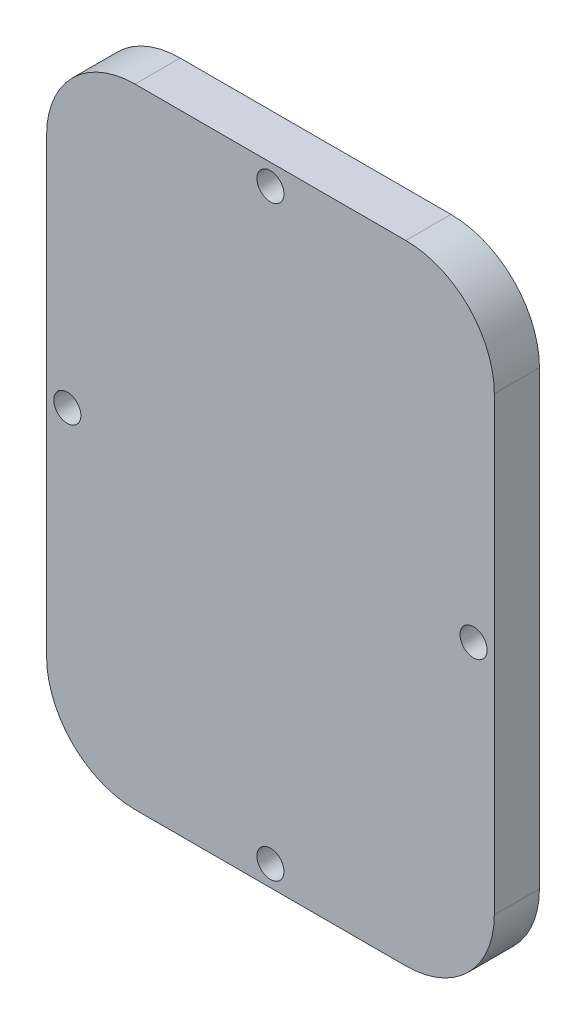
ISO-10303-21;
HEADER;
FILE_DESCRIPTION(('STEP AP214'),'2;1');
FILE_NAME('part.step','',(''),(''),'','','');
FILE_SCHEMA(('AUTOMOTIVE_DESIGN { 1 0 10303 214 1 1 1 1 }'));
ENDSEC;
DATA;
#1=APPLICATION_CONTEXT('core data for automotive mechanical design processes');
#2=APPLICATION_PROTOCOL_DEFINITION('international standard','automotive_design',2000,#1);
#3=PRODUCT_CONTEXT('',#1,'mechanical');
#4=PRODUCT('Part','Part','',(#3));
#5=PRODUCT_RELATED_PRODUCT_CATEGORY('part','',(#4));
#6=PRODUCT_DEFINITION_FORMATION('','',#4);
#7=PRODUCT_DEFINITION_CONTEXT('part definition',#1,'design');
#8=PRODUCT_DEFINITION('design','',#6,#7);
#9=PRODUCT_DEFINITION_SHAPE('','',#8);
#10=(LENGTH_UNIT() NAMED_UNIT(*) SI_UNIT(.MILLI.,.METRE.));
#11=(NAMED_UNIT(*) PLANE_ANGLE_UNIT() SI_UNIT($,.RADIAN.));
#12=(NAMED_UNIT(*) SI_UNIT($,.STERADIAN.) SOLID_ANGLE_UNIT());
#13=UNCERTAINTY_MEASURE_WITH_UNIT(LENGTH_MEASURE(1.E-05),#10,'distance_accuracy_value','');
#14=(GEOMETRIC_REPRESENTATION_CONTEXT(3) GLOBAL_UNCERTAINTY_ASSIGNED_CONTEXT((#13)) GLOBAL_UNIT_ASSIGNED_CONTEXT((#10,
#11,#12)) REPRESENTATION_CONTEXT('',''));
#15=CARTESIAN_POINT('',(0.,0.,0.));
#16=DIRECTION('',(0.,0.,1.));
#17=DIRECTION('',(1.,0.,0.));
#18=AXIS2_PLACEMENT_3D('',#15,#16,#17);
#19=CARTESIAN_POINT('',(24.8,0.,5.));
#20=DIRECTION('',(-1.,0.,0.));
#21=DIRECTION('',(0.,0.,1.));
#22=AXIS2_PLACEMENT_3D('',#19,#20,#21);
#23=PLANE('',#22);
#24=DIRECTION('',(0.,1.,0.));
#25=VECTOR('',#24,1.);
#26=CARTESIAN_POINT('',(24.8,0.,0.));
#27=LINE('',#26,#25);
#28=CARTESIAN_POINT('',(24.8,-24.9999999999999,0.));
#29=VERTEX_POINT('',#28);
#30=CARTESIAN_POINT('',(24.8,24.9999999999999,0.));
#31=VERTEX_POINT('',#30);
#32=EDGE_CURVE('E162',#29,#31,#27,.T.);
#33=ORIENTED_EDGE('',*,*,#32,.T.);
#34=DIRECTION('',(0.,0.,-1.));
#35=VECTOR('',#34,1.);
#36=CARTESIAN_POINT('',(24.8,24.9999999999999,5.));
#37=LINE('',#36,#35);
#38=CARTESIAN_POINT('',(24.8,24.9999999999999,5.));
#39=VERTEX_POINT('',#38);
#40=EDGE_CURVE('E11',#39,#31,#37,.T.);
#41=ORIENTED_EDGE('',*,*,#40,.F.);
#42=DIRECTION('',(0.,1.,0.));
#43=VECTOR('',#42,1.);
#44=CARTESIAN_POINT('',(24.8,0.,5.));
#45=LINE('',#44,#43);
#46=CARTESIAN_POINT('',(24.8,-24.9999999999999,5.));
#47=VERTEX_POINT('',#46);
#48=EDGE_CURVE('E231',#47,#39,#45,.T.);
#49=ORIENTED_EDGE('',*,*,#48,.F.);
#50=DIRECTION('',(0.,0.,-1.));
#51=VECTOR('',#50,1.);
#52=CARTESIAN_POINT('',(24.8,-24.9999999999999,5.));
#53=LINE('',#52,#51);
#54=EDGE_CURVE('E149',#47,#29,#53,.T.);
#55=ORIENTED_EDGE('',*,*,#54,.T.);
#56=EDGE_LOOP('',(#33,#41,#49,#55));
#57=FACE_BOUND('',#56,.T.);
#58=ADVANCED_FACE('F45',(#57),#23,.F.);
#59=CARTESIAN_POINT('',(15.,25.,5.));
#60=DIRECTION('',(0.,0.,-1.));
#61=DIRECTION('',(-1.,0.,0.));
#62=AXIS2_PLACEMENT_3D('',#59,#60,#61);
#63=CYLINDRICAL_SURFACE('',#62,9.8);
#64=CARTESIAN_POINT('',(15.,25.,0.));
#65=DIRECTION('',(0.,0.,1.));
#66=DIRECTION('',(1.,0.,0.));
#67=AXIS2_PLACEMENT_3D('',#64,#65,#66);
#68=CIRCLE('',#67,9.8);
#69=CARTESIAN_POINT('',(14.9999999999999,34.8,0.));
#70=VERTEX_POINT('',#69);
#71=EDGE_CURVE('E166',#31,#70,#68,.T.);
#72=ORIENTED_EDGE('',*,*,#71,.T.);
#73=DIRECTION('',(0.,0.,-1.));
#74=VECTOR('',#73,1.);
#75=CARTESIAN_POINT('',(14.9999999999999,34.8,5.));
#76=LINE('',#75,#74);
#77=CARTESIAN_POINT('',(14.9999999999999,34.8,5.));
#78=VERTEX_POINT('',#77);
#79=EDGE_CURVE('E55',#78,#70,#76,.T.);
#80=ORIENTED_EDGE('',*,*,#79,.F.);
#81=CARTESIAN_POINT('',(15.,25.,5.));
#82=DIRECTION('',(0.,0.,1.));
#83=DIRECTION('',(1.,0.,0.));
#84=AXIS2_PLACEMENT_3D('',#81,#82,#83);
#85=CIRCLE('',#84,9.8);
#86=EDGE_CURVE('E102',#39,#78,#85,.T.);
#87=ORIENTED_EDGE('',*,*,#86,.F.);
#88=ORIENTED_EDGE('',*,*,#40,.T.);
#89=EDGE_LOOP('',(#72,#80,#87,#88));
#90=FACE_BOUND('',#89,.T.);
#91=ADVANCED_FACE('F274',(#90),#63,.T.);
#92=CARTESIAN_POINT('',(0.,34.8,5.));
#93=DIRECTION('',(0.,-1.,0.));
#94=DIRECTION('',(0.,0.,-1.));
#95=AXIS2_PLACEMENT_3D('',#92,#93,#94);
#96=PLANE('',#95);
#97=DIRECTION('',(-1.,0.,0.));
#98=VECTOR('',#97,1.);
#99=CARTESIAN_POINT('',(0.,34.8,0.));
#100=LINE('',#99,#98);
#101=CARTESIAN_POINT('',(-14.9999999999999,34.8,0.));
#102=VERTEX_POINT('',#101);
#103=EDGE_CURVE('E169',#70,#102,#100,.T.);
#104=ORIENTED_EDGE('',*,*,#103,.T.);
#105=DIRECTION('',(0.,0.,-1.));
#106=VECTOR('',#105,1.);
#107=CARTESIAN_POINT('',(-14.9999999999999,34.8,5.));
#108=LINE('',#107,#106);
#109=CARTESIAN_POINT('',(-14.9999999999999,34.8,5.));
#110=VERTEX_POINT('',#109);
#111=EDGE_CURVE('E201',#110,#102,#108,.T.);
#112=ORIENTED_EDGE('',*,*,#111,.F.);
#113=DIRECTION('',(-1.,0.,0.));
#114=VECTOR('',#113,1.);
#115=CARTESIAN_POINT('',(0.,34.8,5.));
#116=LINE('',#115,#114);
#117=EDGE_CURVE('E211',#78,#110,#116,.T.);
#118=ORIENTED_EDGE('',*,*,#117,.F.);
#119=ORIENTED_EDGE('',*,*,#79,.T.);
#120=EDGE_LOOP('',(#104,#112,#118,#119));
#121=FACE_BOUND('',#120,.T.);
#122=ADVANCED_FACE('F209',(#121),#96,.F.);
#123=CARTESIAN_POINT('',(-15.,25.,5.));
#124=DIRECTION('',(0.,0.,-1.));
#125=DIRECTION('',(-1.,0.,0.));
#126=AXIS2_PLACEMENT_3D('',#123,#124,#125);
#127=CYLINDRICAL_SURFACE('',#126,9.80000000000001);
#128=CARTESIAN_POINT('',(-15.,25.,0.));
#129=DIRECTION('',(0.,0.,1.));
#130=DIRECTION('',(1.,0.,0.));
#131=AXIS2_PLACEMENT_3D('',#128,#129,#130);
#132=CIRCLE('',#131,9.80000000000001);
#133=CARTESIAN_POINT('',(-24.8,24.9999999999999,0.));
#134=VERTEX_POINT('',#133);
#135=EDGE_CURVE('E172',#102,#134,#132,.T.);
#136=ORIENTED_EDGE('',*,*,#135,.T.);
#137=DIRECTION('',(0.,0.,-1.));
#138=VECTOR('',#137,1.);
#139=CARTESIAN_POINT('',(-24.8,24.9999999999999,5.));
#140=LINE('',#139,#138);
#141=CARTESIAN_POINT('',(-24.8,24.9999999999999,5.));
#142=VERTEX_POINT('',#141);
#143=EDGE_CURVE('E198',#142,#134,#140,.T.);
#144=ORIENTED_EDGE('',*,*,#143,.F.);
#145=CARTESIAN_POINT('',(-15.,25.,5.));
#146=DIRECTION('',(0.,0.,1.));
#147=DIRECTION('',(1.,0.,0.));
#148=AXIS2_PLACEMENT_3D('',#145,#146,#147);
#149=CIRCLE('',#148,9.80000000000001);
#150=EDGE_CURVE('E222',#110,#142,#149,.T.);
#151=ORIENTED_EDGE('',*,*,#150,.F.);
#152=ORIENTED_EDGE('',*,*,#111,.T.);
#153=EDGE_LOOP('',(#136,#144,#151,#152));
#154=FACE_BOUND('',#153,.T.);
#155=ADVANCED_FACE('F220',(#154),#127,.T.);
#156=CARTESIAN_POINT('',(-24.8,0.,5.));
#157=DIRECTION('',(-1.,0.,0.));
#158=DIRECTION('',(0.,0.,1.));
#159=AXIS2_PLACEMENT_3D('',#156,#157,#158);
#160=PLANE('',#159);
#161=DIRECTION('',(0.,1.,0.));
#162=VECTOR('',#161,1.);
#163=CARTESIAN_POINT('',(-24.8,0.,0.));
#164=LINE('',#163,#162);
#165=CARTESIAN_POINT('',(-24.8,-24.9999999999999,0.));
#166=VERTEX_POINT('',#165);
#167=EDGE_CURVE('E176',#166,#134,#164,.T.);
#168=ORIENTED_EDGE('',*,*,#167,.F.);
#169=DIRECTION('',(0.,0.,-1.));
#170=VECTOR('',#169,1.);
#171=CARTESIAN_POINT('',(-24.8,-24.9999999999999,5.));
#172=LINE('',#171,#170);
#173=CARTESIAN_POINT('',(-24.8,-24.9999999999999,5.));
#174=VERTEX_POINT('',#173);
#175=EDGE_CURVE('E128',#174,#166,#172,.T.);
#176=ORIENTED_EDGE('',*,*,#175,.F.);
#177=DIRECTION('',(0.,1.,0.));
#178=VECTOR('',#177,1.);
#179=CARTESIAN_POINT('',(-24.8,0.,5.));
#180=LINE('',#179,#178);
#181=EDGE_CURVE('E135',#174,#142,#180,.T.);
#182=ORIENTED_EDGE('',*,*,#181,.T.);
#183=ORIENTED_EDGE('',*,*,#143,.T.);
#184=EDGE_LOOP('',(#168,#176,#182,#183));
#185=FACE_BOUND('',#184,.T.);
#186=ADVANCED_FACE('F285',(#185),#160,.T.);
#187=CARTESIAN_POINT('',(-15.,-25.,5.));
#188=DIRECTION('',(0.,0.,-1.));
#189=DIRECTION('',(-1.,0.,0.));
#190=AXIS2_PLACEMENT_3D('',#187,#188,#189);
#191=CYLINDRICAL_SURFACE('',#190,9.8);
#192=CARTESIAN_POINT('',(-15.,-25.,0.));
#193=DIRECTION('',(0.,0.,1.));
#194=DIRECTION('',(1.,0.,0.));
#195=AXIS2_PLACEMENT_3D('',#192,#193,#194);
#196=CIRCLE('',#195,9.8);
#197=CARTESIAN_POINT('',(-14.9999999999999,-34.8,0.));
#198=VERTEX_POINT('',#197);
#199=EDGE_CURVE('E122',#198,#166,#196,.F.);
#200=ORIENTED_EDGE('',*,*,#199,.F.);
#201=DIRECTION('',(0.,0.,-1.));
#202=VECTOR('',#201,1.);
#203=CARTESIAN_POINT('',(-14.9999999999999,-34.8,5.));
#204=LINE('',#203,#202);
#205=CARTESIAN_POINT('',(-14.9999999999999,-34.8,5.));
#206=VERTEX_POINT('',#205);
#207=EDGE_CURVE('E117',#206,#198,#204,.T.);
#208=ORIENTED_EDGE('',*,*,#207,.F.);
#209=CARTESIAN_POINT('',(-15.,-25.,5.));
#210=DIRECTION('',(0.,0.,1.));
#211=DIRECTION('',(1.,0.,0.));
#212=AXIS2_PLACEMENT_3D('',#209,#210,#211);
#213=CIRCLE('',#212,9.8);
#214=EDGE_CURVE('E120',#206,#174,#213,.F.);
#215=ORIENTED_EDGE('',*,*,#214,.T.);
#216=ORIENTED_EDGE('',*,*,#175,.T.);
#217=EDGE_LOOP('',(#200,#208,#215,#216));
#218=FACE_BOUND('',#217,.T.);
#219=ADVANCED_FACE('F119',(#218),#191,.T.);
#220=CARTESIAN_POINT('',(0.,-34.8,5.));
#221=DIRECTION('',(0.,-1.,0.));
#222=DIRECTION('',(1.,0.,0.));
#223=AXIS2_PLACEMENT_3D('',#220,#221,#222);
#224=PLANE('',#223);
#225=DIRECTION('',(-1.,0.,0.));
#226=VECTOR('',#225,1.);
#227=CARTESIAN_POINT('',(0.,-34.8,0.));
#228=LINE('',#227,#226);
#229=CARTESIAN_POINT('',(14.9999999999999,-34.8,0.));
#230=VERTEX_POINT('',#229);
#231=EDGE_CURVE('E182',#230,#198,#228,.T.);
#232=ORIENTED_EDGE('',*,*,#231,.F.);
#233=DIRECTION('',(0.,0.,-1.));
#234=VECTOR('',#233,1.);
#235=CARTESIAN_POINT('',(14.9999999999999,-34.8,5.));
#236=LINE('',#235,#234);
#237=CARTESIAN_POINT('',(14.9999999999999,-34.8,5.));
#238=VERTEX_POINT('',#237);
#239=EDGE_CURVE('E91',#238,#230,#236,.T.);
#240=ORIENTED_EDGE('',*,*,#239,.F.);
#241=DIRECTION('',(-1.,0.,0.));
#242=VECTOR('',#241,1.);
#243=CARTESIAN_POINT('',(0.,-34.8,5.));
#244=LINE('',#243,#242);
#245=EDGE_CURVE('E133',#238,#206,#244,.T.);
#246=ORIENTED_EDGE('',*,*,#245,.T.);
#247=ORIENTED_EDGE('',*,*,#207,.T.);
#248=EDGE_LOOP('',(#232,#240,#246,#247));
#249=FACE_BOUND('',#248,.T.);
#250=ADVANCED_FACE('F138',(#249),#224,.T.);
#251=CARTESIAN_POINT('',(15.,-25.,5.));
#252=DIRECTION('',(0.,0.,-1.));
#253=DIRECTION('',(-1.,0.,0.));
#254=AXIS2_PLACEMENT_3D('',#251,#252,#253);
#255=CYLINDRICAL_SURFACE('',#254,9.8);
#256=CARTESIAN_POINT('',(15.,-25.,0.));
#257=DIRECTION('',(0.,0.,1.));
#258=DIRECTION('',(1.,0.,0.));
#259=AXIS2_PLACEMENT_3D('',#256,#257,#258);
#260=CIRCLE('',#259,9.8);
#261=EDGE_CURVE('E94',#230,#29,#260,.T.);
#262=ORIENTED_EDGE('',*,*,#261,.T.);
#263=ORIENTED_EDGE('',*,*,#54,.F.);
#264=CARTESIAN_POINT('',(15.,-25.,5.));
#265=DIRECTION('',(0.,0.,1.));
#266=DIRECTION('',(1.,0.,0.));
#267=AXIS2_PLACEMENT_3D('',#264,#265,#266);
#268=CIRCLE('',#267,9.8);
#269=EDGE_CURVE('E63',#238,#47,#268,.T.);
#270=ORIENTED_EDGE('',*,*,#269,.F.);
#271=ORIENTED_EDGE('',*,*,#239,.T.);
#272=EDGE_LOOP('',(#262,#263,#270,#271));
#273=FACE_BOUND('',#272,.T.);
#274=ADVANCED_FACE('F263',(#273),#255,.T.);
#275=CARTESIAN_POINT('',(0.,32.5,5.));
#276=DIRECTION('',(0.,0.,-1.));
#277=DIRECTION('',(-1.,0.,0.));
#278=AXIS2_PLACEMENT_3D('',#275,#276,#277);
#279=CYLINDRICAL_SURFACE('',#278,1.5);
#280=CARTESIAN_POINT('',(0.,32.5,5.));
#281=DIRECTION('',(0.,0.,1.));
#282=DIRECTION('',(1.,0.,0.));
#283=AXIS2_PLACEMENT_3D('',#280,#281,#282);
#284=CIRCLE('',#283,1.5);
#285=CARTESIAN_POINT('',(1.5,32.5,5.));
#286=VERTEX_POINT('',#285);
#287=EDGE_CURVE('E234',#286,#286,#284,.T.);
#288=ORIENTED_EDGE('',*,*,#287,.T.);
#289=EDGE_LOOP('',(#288));
#290=FACE_BOUND('',#289,.T.);
#291=CARTESIAN_POINT('',(0.,32.5,0.));
#292=DIRECTION('',(0.,0.,1.));
#293=DIRECTION('',(1.,0.,0.));
#294=AXIS2_PLACEMENT_3D('',#291,#292,#293);
#295=CIRCLE('',#294,1.5);
#296=CARTESIAN_POINT('',(1.5,32.5,0.));
#297=VERTEX_POINT('',#296);
#298=EDGE_CURVE('E158',#297,#297,#295,.T.);
#299=ORIENTED_EDGE('',*,*,#298,.F.);
#300=EDGE_LOOP('',(#299));
#301=FACE_BOUND('',#300,.T.);
#302=ADVANCED_FACE('F261',(#290,#301),#279,.F.);
#303=CARTESIAN_POINT('',(22.5,0.,5.));
#304=DIRECTION('',(0.,0.,-1.));
#305=DIRECTION('',(-1.,0.,0.));
#306=AXIS2_PLACEMENT_3D('',#303,#304,#305);
#307=CYLINDRICAL_SURFACE('',#306,1.5);
#308=CARTESIAN_POINT('',(22.5,0.,5.));
#309=DIRECTION('',(0.,0.,1.));
#310=DIRECTION('',(1.,0.,0.));
#311=AXIS2_PLACEMENT_3D('',#308,#309,#310);
#312=CIRCLE('',#311,1.5);
#313=CARTESIAN_POINT('',(24.,0.,5.));
#314=VERTEX_POINT('',#313);
#315=EDGE_CURVE('E238',#314,#314,#312,.T.);
#316=ORIENTED_EDGE('',*,*,#315,.T.);
#317=EDGE_LOOP('',(#316));
#318=FACE_BOUND('',#317,.T.);
#319=CARTESIAN_POINT('',(22.5,0.,0.));
#320=DIRECTION('',(0.,0.,1.));
#321=DIRECTION('',(1.,0.,0.));
#322=AXIS2_PLACEMENT_3D('',#319,#320,#321);
#323=CIRCLE('',#322,1.5);
#324=CARTESIAN_POINT('',(24.,0.,0.));
#325=VERTEX_POINT('',#324);
#326=EDGE_CURVE('E154',#325,#325,#323,.T.);
#327=ORIENTED_EDGE('',*,*,#326,.F.);
#328=EDGE_LOOP('',(#327));
#329=FACE_BOUND('',#328,.T.);
#330=ADVANCED_FACE('F251',(#318,#329),#307,.F.);
#331=CARTESIAN_POINT('',(0.,-32.5,5.));
#332=DIRECTION('',(0.,0.,-1.));
#333=DIRECTION('',(-1.,0.,0.));
#334=AXIS2_PLACEMENT_3D('',#331,#332,#333);
#335=CYLINDRICAL_SURFACE('',#334,1.5);
#336=CARTESIAN_POINT('',(0.,-32.5,5.));
#337=DIRECTION('',(0.,0.,1.));
#338=DIRECTION('',(1.,0.,0.));
#339=AXIS2_PLACEMENT_3D('',#336,#337,#338);
#340=CIRCLE('',#339,1.5);
#341=CARTESIAN_POINT('',(1.50000000000002,-32.5,5.));
#342=VERTEX_POINT('',#341);
#343=EDGE_CURVE('E191',#342,#342,#340,.F.);
#344=ORIENTED_EDGE('',*,*,#343,.F.);
#345=EDGE_LOOP('',(#344));
#346=FACE_BOUND('',#345,.T.);
#347=CARTESIAN_POINT('',(0.,-32.5,0.));
#348=DIRECTION('',(0.,0.,1.));
#349=DIRECTION('',(1.,0.,0.));
#350=AXIS2_PLACEMENT_3D('',#347,#348,#349);
#351=CIRCLE('',#350,1.5);
#352=CARTESIAN_POINT('',(1.50000000000002,-32.5,0.));
#353=VERTEX_POINT('',#352);
#354=EDGE_CURVE('E150',#353,#353,#351,.F.);
#355=ORIENTED_EDGE('',*,*,#354,.T.);
#356=EDGE_LOOP('',(#355));
#357=FACE_BOUND('',#356,.T.);
#358=ADVANCED_FACE('F47',(#346,#357),#335,.F.);
#359=CARTESIAN_POINT('',(-22.5,0.,5.));
#360=DIRECTION('',(0.,0.,-1.));
#361=DIRECTION('',(-1.,0.,0.));
#362=AXIS2_PLACEMENT_3D('',#359,#360,#361);
#363=CYLINDRICAL_SURFACE('',#362,1.5);
#364=CARTESIAN_POINT('',(-22.5,0.,5.));
#365=DIRECTION('',(0.,0.,1.));
#366=DIRECTION('',(1.,0.,0.));
#367=AXIS2_PLACEMENT_3D('',#364,#365,#366);
#368=CIRCLE('',#367,1.5);
#369=CARTESIAN_POINT('',(-21.,0.,5.));
#370=VERTEX_POINT('',#369);
#371=EDGE_CURVE('E142',#370,#370,#368,.F.);
#372=ORIENTED_EDGE('',*,*,#371,.F.);
#373=EDGE_LOOP('',(#372));
#374=FACE_BOUND('',#373,.T.);
#375=CARTESIAN_POINT('',(-22.5,0.,0.));
#376=DIRECTION('',(0.,0.,1.));
#377=DIRECTION('',(1.,0.,0.));
#378=AXIS2_PLACEMENT_3D('',#375,#376,#377);
#379=CIRCLE('',#378,1.5);
#380=CARTESIAN_POINT('',(-21.,0.,0.));
#381=VERTEX_POINT('',#380);
#382=EDGE_CURVE('E187',#381,#381,#379,.F.);
#383=ORIENTED_EDGE('',*,*,#382,.T.);
#384=EDGE_LOOP('',(#383));
#385=FACE_BOUND('',#384,.T.);
#386=ADVANCED_FACE('F250',(#374,#385),#363,.F.);
#387=CARTESIAN_POINT('',(0.,0.,5.));
#388=DIRECTION('',(0.,0.,1.));
#389=DIRECTION('',(1.,0.,0.));
#390=AXIS2_PLACEMENT_3D('',#387,#388,#389);
#391=PLANE('',#390);
#392=ORIENTED_EDGE('',*,*,#343,.T.);
#393=EDGE_LOOP('',(#392));
#394=FACE_BOUND('',#393,.T.);
#395=ORIENTED_EDGE('',*,*,#315,.F.);
#396=EDGE_LOOP('',(#395));
#397=FACE_BOUND('',#396,.T.);
#398=ORIENTED_EDGE('',*,*,#287,.F.);
#399=EDGE_LOOP('',(#398));
#400=FACE_BOUND('',#399,.T.);
#401=ORIENTED_EDGE('',*,*,#48,.T.);
#402=ORIENTED_EDGE('',*,*,#86,.T.);
#403=ORIENTED_EDGE('',*,*,#117,.T.);
#404=ORIENTED_EDGE('',*,*,#150,.T.);
#405=ORIENTED_EDGE('',*,*,#181,.F.);
#406=ORIENTED_EDGE('',*,*,#214,.F.);
#407=ORIENTED_EDGE('',*,*,#245,.F.);
#408=ORIENTED_EDGE('',*,*,#269,.T.);
#409=EDGE_LOOP('',(#401,#402,#403,#404,#405,#406,#407,#408));
#410=FACE_BOUND('',#409,.T.);
#411=ORIENTED_EDGE('',*,*,#371,.T.);
#412=EDGE_LOOP('',(#411));
#413=FACE_BOUND('',#412,.T.);
#414=ADVANCED_FACE('F131',(#394,#397,#400,#410,#413),#391,.T.);
#415=CARTESIAN_POINT('',(0.,0.,0.));
#416=DIRECTION('',(0.,0.,1.));
#417=DIRECTION('',(1.,0.,0.));
#418=AXIS2_PLACEMENT_3D('',#415,#416,#417);
#419=PLANE('',#418);
#420=ORIENTED_EDGE('',*,*,#354,.F.);
#421=EDGE_LOOP('',(#420));
#422=FACE_BOUND('',#421,.T.);
#423=ORIENTED_EDGE('',*,*,#326,.T.);
#424=EDGE_LOOP('',(#423));
#425=FACE_BOUND('',#424,.T.);
#426=ORIENTED_EDGE('',*,*,#298,.T.);
#427=EDGE_LOOP('',(#426));
#428=FACE_BOUND('',#427,.T.);
#429=ORIENTED_EDGE('',*,*,#32,.F.);
#430=ORIENTED_EDGE('',*,*,#261,.F.);
#431=ORIENTED_EDGE('',*,*,#231,.T.);
#432=ORIENTED_EDGE('',*,*,#199,.T.);
#433=ORIENTED_EDGE('',*,*,#167,.T.);
#434=ORIENTED_EDGE('',*,*,#135,.F.);
#435=ORIENTED_EDGE('',*,*,#103,.F.);
#436=ORIENTED_EDGE('',*,*,#71,.F.);
#437=EDGE_LOOP('',(#429,#430,#431,#432,#433,#434,#435,#436));
#438=FACE_BOUND('',#437,.T.);
#439=ORIENTED_EDGE('',*,*,#382,.F.);
#440=EDGE_LOOP('',(#439));
#441=FACE_BOUND('',#440,.T.);
#442=ADVANCED_FACE('F215',(#422,#425,#428,#438,#441),#419,.F.);
#443=CLOSED_SHELL('',(#58,#91,#122,#155,#186,#219,#250,#274,#302,#330,#358,#386,#414,#442));
#444=MANIFOLD_SOLID_BREP('B2',#443);
#445=ADVANCED_BREP_SHAPE_REPRESENTATION('',(#18,#444),#14);
#446=SHAPE_DEFINITION_REPRESENTATION(#9,#445);
ENDSEC;
END-ISO-10303-21;
